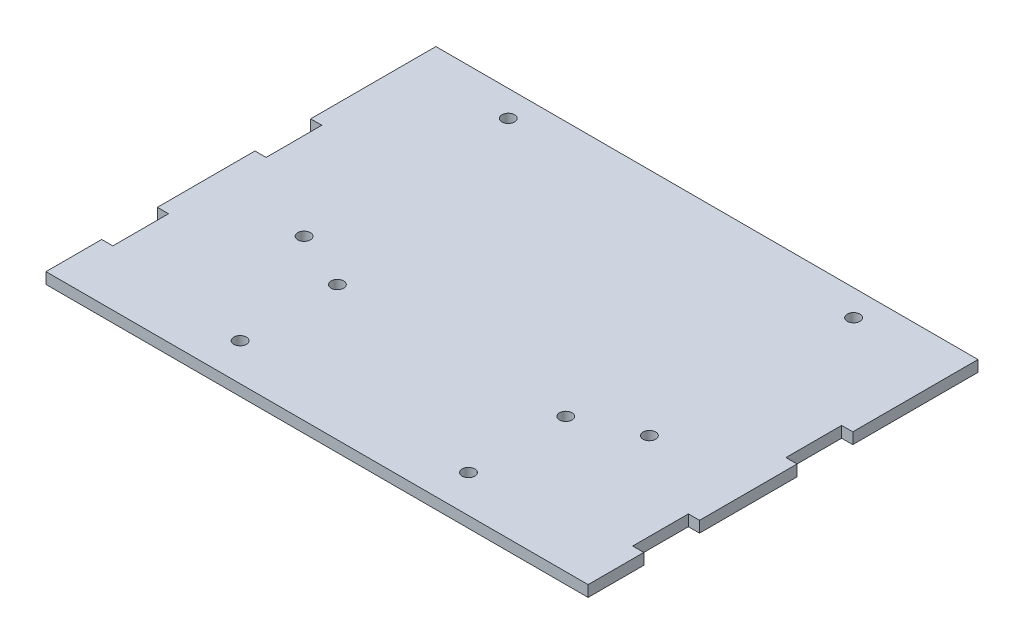
ISO-10303-21;
HEADER;
FILE_DESCRIPTION(('STEP AP214'),'2;1');
FILE_NAME('part.step','',(''),(''),'','','');
FILE_SCHEMA(('AUTOMOTIVE_DESIGN { 1 0 10303 214 1 1 1 1 }'));
ENDSEC;
DATA;
#1=APPLICATION_CONTEXT('core data for automotive mechanical design processes');
#2=APPLICATION_PROTOCOL_DEFINITION('international standard','automotive_design',2000,#1);
#3=PRODUCT_CONTEXT('',#1,'mechanical');
#4=PRODUCT('Part','Part','',(#3));
#5=PRODUCT_RELATED_PRODUCT_CATEGORY('part','',(#4));
#6=PRODUCT_DEFINITION_FORMATION('','',#4);
#7=PRODUCT_DEFINITION_CONTEXT('part definition',#1,'design');
#8=PRODUCT_DEFINITION('design','',#6,#7);
#9=PRODUCT_DEFINITION_SHAPE('','',#8);
#10=(LENGTH_UNIT() NAMED_UNIT(*) SI_UNIT(.MILLI.,.METRE.));
#11=(NAMED_UNIT(*) PLANE_ANGLE_UNIT() SI_UNIT($,.RADIAN.));
#12=(NAMED_UNIT(*) SI_UNIT($,.STERADIAN.) SOLID_ANGLE_UNIT());
#13=UNCERTAINTY_MEASURE_WITH_UNIT(LENGTH_MEASURE(1.E-05),#10,'distance_accuracy_value','');
#14=(GEOMETRIC_REPRESENTATION_CONTEXT(3) GLOBAL_UNCERTAINTY_ASSIGNED_CONTEXT((#13)) GLOBAL_UNIT_ASSIGNED_CONTEXT((#10,
#11,#12)) REPRESENTATION_CONTEXT('',''));
#15=CARTESIAN_POINT('',(0.,0.,0.));
#16=DIRECTION('',(0.,0.,1.));
#17=DIRECTION('',(1.,0.,0.));
#18=AXIS2_PLACEMENT_3D('',#15,#16,#17);
#19=CARTESIAN_POINT('',(-73.,3.,52.5));
#20=DIRECTION('',(1.,0.,0.));
#21=DIRECTION('',(0.,0.,-1.));
#22=AXIS2_PLACEMENT_3D('',#19,#20,#21);
#23=PLANE('',#22);
#24=DIRECTION('',(0.,0.,1.));
#25=VECTOR('',#24,1.);
#26=CARTESIAN_POINT('',(-73.,0.,52.5));
#27=LINE('',#26,#25);
#28=CARTESIAN_POINT('',(-73.,0.,-3.76999999999999));
#29=VERTEX_POINT('',#28);
#30=CARTESIAN_POINT('',(-73.,0.,22.5));
#31=VERTEX_POINT('',#30);
#32=EDGE_CURVE('E442',#29,#31,#27,.T.);
#33=ORIENTED_EDGE('',*,*,#32,.T.);
#34=DIRECTION('',(0.,1.,0.));
#35=VECTOR('',#34,1.);
#36=CARTESIAN_POINT('',(-73.,0.,22.5));
#37=LINE('',#36,#35);
#38=CARTESIAN_POINT('',(-73.,3.,22.5));
#39=VERTEX_POINT('',#38);
#40=EDGE_CURVE('E307',#31,#39,#37,.T.);
#41=ORIENTED_EDGE('',*,*,#40,.T.);
#42=DIRECTION('',(0.,0.,1.));
#43=VECTOR('',#42,1.);
#44=CARTESIAN_POINT('',(-73.,3.,52.5));
#45=LINE('',#44,#43);
#46=CARTESIAN_POINT('',(-73.,3.,-3.76999999999999));
#47=VERTEX_POINT('',#46);
#48=EDGE_CURVE('E216',#47,#39,#45,.T.);
#49=ORIENTED_EDGE('',*,*,#48,.F.);
#50=DIRECTION('',(0.,1.,0.));
#51=VECTOR('',#50,1.);
#52=CARTESIAN_POINT('',(-73.,0.,-3.76999999999999));
#53=LINE('',#52,#51);
#54=EDGE_CURVE('E450',#29,#47,#53,.T.);
#55=ORIENTED_EDGE('',*,*,#54,.F.);
#56=EDGE_LOOP('',(#33,#41,#49,#55));
#57=FACE_BOUND('',#56,.T.);
#58=ADVANCED_FACE('F45',(#57),#23,.F.);
#59=CARTESIAN_POINT('',(-73.,0.,-52.5));
#60=VERTEX_POINT('',#59);
#61=CARTESIAN_POINT('',(-73.,0.,-18.77));
#62=VERTEX_POINT('',#61);
#63=EDGE_CURVE('E204',#60,#62,#27,.T.);
#64=ORIENTED_EDGE('',*,*,#63,.T.);
#65=DIRECTION('',(0.,1.,0.));
#66=VECTOR('',#65,1.);
#67=CARTESIAN_POINT('',(-73.,0.,-18.77));
#68=LINE('',#67,#66);
#69=CARTESIAN_POINT('',(-73.,3.,-18.77));
#70=VERTEX_POINT('',#69);
#71=EDGE_CURVE('E186',#62,#70,#68,.T.);
#72=ORIENTED_EDGE('',*,*,#71,.T.);
#73=CARTESIAN_POINT('',(-73.,3.,-52.5));
#74=VERTEX_POINT('',#73);
#75=EDGE_CURVE('E202',#74,#70,#45,.T.);
#76=ORIENTED_EDGE('',*,*,#75,.F.);
#77=DIRECTION('',(0.,-1.,0.));
#78=VECTOR('',#77,1.);
#79=CARTESIAN_POINT('',(-73.,3.,-52.5));
#80=LINE('',#79,#78);
#81=EDGE_CURVE('E243',#74,#60,#80,.T.);
#82=ORIENTED_EDGE('',*,*,#81,.T.);
#83=EDGE_LOOP('',(#64,#72,#76,#82));
#84=FACE_BOUND('',#83,.T.);
#85=ADVANCED_FACE('F200',(#84),#23,.F.);
#86=CARTESIAN_POINT('',(73.,3.,52.5));
#87=DIRECTION('',(-1.,0.,0.));
#88=DIRECTION('',(0.,0.,1.));
#89=AXIS2_PLACEMENT_3D('',#86,#87,#88);
#90=PLANE('',#89);
#91=DIRECTION('',(0.,0.,-1.));
#92=VECTOR('',#91,1.);
#93=CARTESIAN_POINT('',(73.,0.,52.5));
#94=LINE('',#93,#92);
#95=CARTESIAN_POINT('',(73.,0.,22.5));
#96=VERTEX_POINT('',#95);
#97=CARTESIAN_POINT('',(73.,0.,-3.76999999999999));
#98=VERTEX_POINT('',#97);
#99=EDGE_CURVE('E238',#96,#98,#94,.T.);
#100=ORIENTED_EDGE('',*,*,#99,.T.);
#101=DIRECTION('',(0.,1.,0.));
#102=VECTOR('',#101,1.);
#103=CARTESIAN_POINT('',(73.,0.,-3.76999999999999));
#104=LINE('',#103,#102);
#105=CARTESIAN_POINT('',(73.,3.,-3.76999999999999));
#106=VERTEX_POINT('',#105);
#107=EDGE_CURVE('E480',#98,#106,#104,.T.);
#108=ORIENTED_EDGE('',*,*,#107,.T.);
#109=DIRECTION('',(0.,0.,-1.));
#110=VECTOR('',#109,1.);
#111=CARTESIAN_POINT('',(73.,3.,52.5));
#112=LINE('',#111,#110);
#113=CARTESIAN_POINT('',(73.,3.,22.5));
#114=VERTEX_POINT('',#113);
#115=EDGE_CURVE('E425',#114,#106,#112,.T.);
#116=ORIENTED_EDGE('',*,*,#115,.F.);
#117=DIRECTION('',(0.,1.,0.));
#118=VECTOR('',#117,1.);
#119=CARTESIAN_POINT('',(73.,0.,22.5));
#120=LINE('',#119,#118);
#121=EDGE_CURVE('E272',#96,#114,#120,.T.);
#122=ORIENTED_EDGE('',*,*,#121,.F.);
#123=EDGE_LOOP('',(#100,#108,#116,#122));
#124=FACE_BOUND('',#123,.T.);
#125=ADVANCED_FACE('F410',(#124),#90,.F.);
#126=CARTESIAN_POINT('',(73.,0.,52.5));
#127=VERTEX_POINT('',#126);
#128=CARTESIAN_POINT('',(73.,0.,37.5));
#129=VERTEX_POINT('',#128);
#130=EDGE_CURVE('E231',#127,#129,#94,.T.);
#131=ORIENTED_EDGE('',*,*,#130,.T.);
#132=DIRECTION('',(0.,1.,0.));
#133=VECTOR('',#132,1.);
#134=CARTESIAN_POINT('',(73.,0.,37.5));
#135=LINE('',#134,#133);
#136=CARTESIAN_POINT('',(73.,3.,37.5));
#137=VERTEX_POINT('',#136);
#138=EDGE_CURVE('E509',#129,#137,#135,.T.);
#139=ORIENTED_EDGE('',*,*,#138,.T.);
#140=CARTESIAN_POINT('',(73.,3.,52.5));
#141=VERTEX_POINT('',#140);
#142=EDGE_CURVE('E257',#141,#137,#112,.T.);
#143=ORIENTED_EDGE('',*,*,#142,.F.);
#144=DIRECTION('',(0.,-1.,0.));
#145=VECTOR('',#144,1.);
#146=CARTESIAN_POINT('',(73.,3.,52.5));
#147=LINE('',#146,#145);
#148=EDGE_CURVE('E54',#141,#127,#147,.T.);
#149=ORIENTED_EDGE('',*,*,#148,.T.);
#150=EDGE_LOOP('',(#131,#139,#143,#149));
#151=FACE_BOUND('',#150,.T.);
#152=ADVANCED_FACE('F254',(#151),#90,.F.);
#153=CARTESIAN_POINT('',(-73.,3.,37.5));
#154=VERTEX_POINT('',#153);
#155=CARTESIAN_POINT('',(-73.,3.,52.5));
#156=VERTEX_POINT('',#155);
#157=EDGE_CURVE('E218',#154,#156,#45,.T.);
#158=ORIENTED_EDGE('',*,*,#157,.F.);
#159=DIRECTION('',(0.,1.,0.));
#160=VECTOR('',#159,1.);
#161=CARTESIAN_POINT('',(-73.,0.,37.5));
#162=LINE('',#161,#160);
#163=CARTESIAN_POINT('',(-73.,0.,37.5));
#164=VERTEX_POINT('',#163);
#165=EDGE_CURVE('E297',#164,#154,#162,.T.);
#166=ORIENTED_EDGE('',*,*,#165,.F.);
#167=CARTESIAN_POINT('',(-73.,0.,52.5));
#168=VERTEX_POINT('',#167);
#169=EDGE_CURVE('E382',#164,#168,#27,.T.);
#170=ORIENTED_EDGE('',*,*,#169,.T.);
#171=DIRECTION('',(0.,-1.,0.));
#172=VECTOR('',#171,1.);
#173=CARTESIAN_POINT('',(-73.,3.,52.5));
#174=LINE('',#173,#172);
#175=EDGE_CURVE('E11',#156,#168,#174,.T.);
#176=ORIENTED_EDGE('',*,*,#175,.F.);
#177=EDGE_LOOP('',(#158,#166,#170,#176));
#178=FACE_BOUND('',#177,.T.);
#179=ADVANCED_FACE('F47',(#178),#23,.F.);
#180=CARTESIAN_POINT('',(73.,3.,52.5));
#181=DIRECTION('',(0.,0.,-1.));
#182=DIRECTION('',(-1.,0.,0.));
#183=AXIS2_PLACEMENT_3D('',#180,#181,#182);
#184=PLANE('',#183);
#185=DIRECTION('',(1.,0.,0.));
#186=VECTOR('',#185,1.);
#187=CARTESIAN_POINT('',(73.,0.,52.5));
#188=LINE('',#187,#186);
#189=EDGE_CURVE('E264',#168,#127,#188,.T.);
#190=ORIENTED_EDGE('',*,*,#189,.T.);
#191=ORIENTED_EDGE('',*,*,#148,.F.);
#192=DIRECTION('',(1.,0.,0.));
#193=VECTOR('',#192,1.);
#194=CARTESIAN_POINT('',(73.,3.,52.5));
#195=LINE('',#194,#193);
#196=EDGE_CURVE('E215',#156,#141,#195,.T.);
#197=ORIENTED_EDGE('',*,*,#196,.F.);
#198=ORIENTED_EDGE('',*,*,#175,.T.);
#199=EDGE_LOOP('',(#190,#191,#197,#198));
#200=FACE_BOUND('',#199,.T.);
#201=ADVANCED_FACE('F413',(#200),#184,.F.);
#202=CARTESIAN_POINT('',(73.,3.,-18.77));
#203=VERTEX_POINT('',#202);
#204=CARTESIAN_POINT('',(73.,3.,-52.5));
#205=VERTEX_POINT('',#204);
#206=EDGE_CURVE('E221',#203,#205,#112,.T.);
#207=ORIENTED_EDGE('',*,*,#206,.F.);
#208=DIRECTION('',(0.,1.,0.));
#209=VECTOR('',#208,1.);
#210=CARTESIAN_POINT('',(73.,0.,-18.77));
#211=LINE('',#210,#209);
#212=CARTESIAN_POINT('',(73.,0.,-18.77));
#213=VERTEX_POINT('',#212);
#214=EDGE_CURVE('E470',#213,#203,#211,.T.);
#215=ORIENTED_EDGE('',*,*,#214,.F.);
#216=CARTESIAN_POINT('',(73.,0.,-52.5));
#217=VERTEX_POINT('',#216);
#218=EDGE_CURVE('E240',#213,#217,#94,.T.);
#219=ORIENTED_EDGE('',*,*,#218,.T.);
#220=DIRECTION('',(0.,-1.,0.));
#221=VECTOR('',#220,1.);
#222=CARTESIAN_POINT('',(73.,3.,-52.5));
#223=LINE('',#222,#221);
#224=EDGE_CURVE('E246',#205,#217,#223,.T.);
#225=ORIENTED_EDGE('',*,*,#224,.F.);
#226=EDGE_LOOP('',(#207,#215,#219,#225));
#227=FACE_BOUND('',#226,.T.);
#228=ADVANCED_FACE('F400',(#227),#90,.F.);
#229=CARTESIAN_POINT('',(73.,3.,-52.5));
#230=DIRECTION('',(0.,0.,1.));
#231=DIRECTION('',(1.,0.,0.));
#232=AXIS2_PLACEMENT_3D('',#229,#230,#231);
#233=PLANE('',#232);
#234=DIRECTION('',(-1.,0.,0.));
#235=VECTOR('',#234,1.);
#236=CARTESIAN_POINT('',(73.,0.,-52.5));
#237=LINE('',#236,#235);
#238=EDGE_CURVE('E226',#217,#60,#237,.T.);
#239=ORIENTED_EDGE('',*,*,#238,.T.);
#240=ORIENTED_EDGE('',*,*,#81,.F.);
#241=DIRECTION('',(-1.,0.,0.));
#242=VECTOR('',#241,1.);
#243=CARTESIAN_POINT('',(73.,3.,-52.5));
#244=LINE('',#243,#242);
#245=EDGE_CURVE('E212',#205,#74,#244,.T.);
#246=ORIENTED_EDGE('',*,*,#245,.F.);
#247=ORIENTED_EDGE('',*,*,#224,.T.);
#248=EDGE_LOOP('',(#239,#240,#246,#247));
#249=FACE_BOUND('',#248,.T.);
#250=ADVANCED_FACE('F390',(#249),#233,.F.);
#251=CARTESIAN_POINT('',(0.,3.,0.));
#252=DIRECTION('',(0.,1.,0.));
#253=DIRECTION('',(0.,0.,1.));
#254=AXIS2_PLACEMENT_3D('',#251,#252,#253);
#255=PLANE('',#254);
#256=CARTESIAN_POINT('',(30.75,3.,42.478395091037));
#257=DIRECTION('',(0.,1.,0.));
#258=DIRECTION('',(0.,0.,1.));
#259=AXIS2_PLACEMENT_3D('',#256,#257,#258);
#260=CIRCLE('',#259,1.7);
#261=CARTESIAN_POINT('',(30.75,3.,44.178395091037));
#262=VERTEX_POINT('',#261);
#263=EDGE_CURVE('E331',#262,#262,#260,.T.);
#264=ORIENTED_EDGE('',*,*,#263,.F.);
#265=EDGE_LOOP('',(#264));
#266=FACE_BOUND('',#265,.T.);
#267=CARTESIAN_POINT('',(-30.75,3.,16.278395091037));
#268=DIRECTION('',(0.,1.,0.));
#269=DIRECTION('',(0.,0.,1.));
#270=AXIS2_PLACEMENT_3D('',#267,#268,#269);
#271=CIRCLE('',#270,1.7);
#272=CARTESIAN_POINT('',(-30.75,3.,17.978395091037));
#273=VERTEX_POINT('',#272);
#274=EDGE_CURVE('E340',#273,#273,#271,.T.);
#275=ORIENTED_EDGE('',*,*,#274,.F.);
#276=EDGE_LOOP('',(#275));
#277=FACE_BOUND('',#276,.T.);
#278=CARTESIAN_POINT('',(-30.75,3.,42.478395091037));
#279=DIRECTION('',(0.,1.,0.));
#280=DIRECTION('',(0.,0.,1.));
#281=AXIS2_PLACEMENT_3D('',#278,#279,#280);
#282=CIRCLE('',#281,1.7);
#283=CARTESIAN_POINT('',(-30.75,3.,44.178395091037));
#284=VERTEX_POINT('',#283);
#285=EDGE_CURVE('E287',#284,#284,#282,.T.);
#286=ORIENTED_EDGE('',*,*,#285,.F.);
#287=EDGE_LOOP('',(#286));
#288=FACE_BOUND('',#287,.T.);
#289=DIRECTION('',(-1.,0.,0.));
#290=VECTOR('',#289,1.);
#291=CARTESIAN_POINT('',(-70.,3.,22.5));
#292=LINE('',#291,#290);
#293=CARTESIAN_POINT('',(-70.,3.,22.5));
#294=VERTEX_POINT('',#293);
#295=EDGE_CURVE('E312',#294,#39,#292,.T.);
#296=ORIENTED_EDGE('',*,*,#295,.F.);
#297=DIRECTION('',(0.,0.,-1.));
#298=VECTOR('',#297,1.);
#299=CARTESIAN_POINT('',(-70.,3.,37.5));
#300=LINE('',#299,#298);
#301=CARTESIAN_POINT('',(-70.,3.,37.5));
#302=VERTEX_POINT('',#301);
#303=EDGE_CURVE('E315',#302,#294,#300,.T.);
#304=ORIENTED_EDGE('',*,*,#303,.F.);
#305=DIRECTION('',(1.,0.,0.));
#306=VECTOR('',#305,1.);
#307=CARTESIAN_POINT('',(-73.,3.,37.5));
#308=LINE('',#307,#306);
#309=EDGE_CURVE('E296',#154,#302,#308,.T.);
#310=ORIENTED_EDGE('',*,*,#309,.F.);
#311=ORIENTED_EDGE('',*,*,#157,.T.);
#312=ORIENTED_EDGE('',*,*,#196,.T.);
#313=ORIENTED_EDGE('',*,*,#142,.T.);
#314=DIRECTION('',(1.,0.,0.));
#315=VECTOR('',#314,1.);
#316=CARTESIAN_POINT('',(70.,3.,37.5));
#317=LINE('',#316,#315);
#318=CARTESIAN_POINT('',(70.,3.,37.5));
#319=VERTEX_POINT('',#318);
#320=EDGE_CURVE('E286',#319,#137,#317,.T.);
#321=ORIENTED_EDGE('',*,*,#320,.F.);
#322=DIRECTION('',(0.,0.,1.));
#323=VECTOR('',#322,1.);
#324=CARTESIAN_POINT('',(70.,3.,22.5));
#325=LINE('',#324,#323);
#326=CARTESIAN_POINT('',(70.,3.,22.5));
#327=VERTEX_POINT('',#326);
#328=EDGE_CURVE('E513',#327,#319,#325,.T.);
#329=ORIENTED_EDGE('',*,*,#328,.F.);
#330=DIRECTION('',(-1.,0.,0.));
#331=VECTOR('',#330,1.);
#332=CARTESIAN_POINT('',(73.,3.,22.5));
#333=LINE('',#332,#331);
#334=EDGE_CURVE('E281',#114,#327,#333,.T.);
#335=ORIENTED_EDGE('',*,*,#334,.F.);
#336=ORIENTED_EDGE('',*,*,#115,.T.);
#337=DIRECTION('',(1.,0.,0.));
#338=VECTOR('',#337,1.);
#339=CARTESIAN_POINT('',(70.,3.,-3.76999999999999));
#340=LINE('',#339,#338);
#341=CARTESIAN_POINT('',(70.,3.,-3.76999999999999));
#342=VERTEX_POINT('',#341);
#343=EDGE_CURVE('E484',#342,#106,#340,.T.);
#344=ORIENTED_EDGE('',*,*,#343,.F.);
#345=DIRECTION('',(0.,0.,1.));
#346=VECTOR('',#345,1.);
#347=CARTESIAN_POINT('',(70.,3.,-18.77));
#348=LINE('',#347,#346);
#349=CARTESIAN_POINT('',(70.,3.,-18.77));
#350=VERTEX_POINT('',#349);
#351=EDGE_CURVE('E487',#350,#342,#348,.T.);
#352=ORIENTED_EDGE('',*,*,#351,.F.);
#353=DIRECTION('',(-1.,0.,0.));
#354=VECTOR('',#353,1.);
#355=CARTESIAN_POINT('',(73.,3.,-18.77));
#356=LINE('',#355,#354);
#357=EDGE_CURVE('E206',#203,#350,#356,.T.);
#358=ORIENTED_EDGE('',*,*,#357,.F.);
#359=ORIENTED_EDGE('',*,*,#206,.T.);
#360=ORIENTED_EDGE('',*,*,#245,.T.);
#361=ORIENTED_EDGE('',*,*,#75,.T.);
#362=DIRECTION('',(-1.,0.,0.));
#363=VECTOR('',#362,1.);
#364=CARTESIAN_POINT('',(-70.,3.,-18.77));
#365=LINE('',#364,#363);
#366=CARTESIAN_POINT('',(-70.,3.,-18.77));
#367=VERTEX_POINT('',#366);
#368=EDGE_CURVE('E182',#367,#70,#365,.T.);
#369=ORIENTED_EDGE('',*,*,#368,.F.);
#370=DIRECTION('',(0.,0.,-1.));
#371=VECTOR('',#370,1.);
#372=CARTESIAN_POINT('',(-70.,3.,-3.76999999999999));
#373=LINE('',#372,#371);
#374=CARTESIAN_POINT('',(-70.,3.,-3.76999999999999));
#375=VERTEX_POINT('',#374);
#376=EDGE_CURVE('E194',#375,#367,#373,.T.);
#377=ORIENTED_EDGE('',*,*,#376,.F.);
#378=DIRECTION('',(1.,0.,0.));
#379=VECTOR('',#378,1.);
#380=CARTESIAN_POINT('',(-73.,3.,-3.76999999999999));
#381=LINE('',#380,#379);
#382=EDGE_CURVE('E311',#47,#375,#381,.T.);
#383=ORIENTED_EDGE('',*,*,#382,.F.);
#384=ORIENTED_EDGE('',*,*,#48,.T.);
#385=EDGE_LOOP('',(#296,#304,#310,#311,#312,#313,#321,#329,#335,#336,#344,#352,#358,#359,#360,
#361,#369,#377,#383,#384));
#386=FACE_BOUND('',#385,.T.);
#387=CARTESIAN_POINT('',(30.75,3.,16.278395091037));
#388=DIRECTION('',(0.,1.,0.));
#389=DIRECTION('',(0.,0.,1.));
#390=AXIS2_PLACEMENT_3D('',#387,#388,#389);
#391=CIRCLE('',#390,1.7);
#392=CARTESIAN_POINT('',(30.75,3.,17.978395091037));
#393=VERTEX_POINT('',#392);
#394=EDGE_CURVE('E372',#393,#393,#391,.T.);
#395=ORIENTED_EDGE('',*,*,#394,.F.);
#396=EDGE_LOOP('',(#395));
#397=FACE_BOUND('',#396,.T.);
#398=CARTESIAN_POINT('',(-46.5,3.,9.5));
#399=DIRECTION('',(0.,1.,0.));
#400=DIRECTION('',(0.,0.,1.));
#401=AXIS2_PLACEMENT_3D('',#398,#399,#400);
#402=CIRCLE('',#401,1.7);
#403=CARTESIAN_POINT('',(-46.5,3.,11.2));
#404=VERTEX_POINT('',#403);
#405=EDGE_CURVE('E364',#404,#404,#402,.T.);
#406=ORIENTED_EDGE('',*,*,#405,.F.);
#407=EDGE_LOOP('',(#406));
#408=FACE_BOUND('',#407,.T.);
#409=CARTESIAN_POINT('',(46.5,3.,9.5));
#410=DIRECTION('',(0.,1.,0.));
#411=DIRECTION('',(0.,0.,1.));
#412=AXIS2_PLACEMENT_3D('',#409,#410,#411);
#413=CIRCLE('',#412,1.7);
#414=CARTESIAN_POINT('',(46.5,3.,11.2));
#415=VERTEX_POINT('',#414);
#416=EDGE_CURVE('E356',#415,#415,#413,.T.);
#417=ORIENTED_EDGE('',*,*,#416,.F.);
#418=EDGE_LOOP('',(#417));
#419=FACE_BOUND('',#418,.T.);
#420=CARTESIAN_POINT('',(46.5,3.,-45.5));
#421=DIRECTION('',(0.,1.,0.));
#422=DIRECTION('',(0.,0.,1.));
#423=AXIS2_PLACEMENT_3D('',#420,#421,#422);
#424=CIRCLE('',#423,1.7);
#425=CARTESIAN_POINT('',(46.5,3.,-43.8));
#426=VERTEX_POINT('',#425);
#427=EDGE_CURVE('E347',#426,#426,#424,.T.);
#428=ORIENTED_EDGE('',*,*,#427,.F.);
#429=EDGE_LOOP('',(#428));
#430=FACE_BOUND('',#429,.T.);
#431=CARTESIAN_POINT('',(-46.5,3.,-45.5));
#432=DIRECTION('',(0.,1.,0.));
#433=DIRECTION('',(0.,0.,1.));
#434=AXIS2_PLACEMENT_3D('',#431,#432,#433);
#435=CIRCLE('',#434,1.7);
#436=CARTESIAN_POINT('',(-46.5,3.,-43.8));
#437=VERTEX_POINT('',#436);
#438=EDGE_CURVE('E351',#437,#437,#435,.T.);
#439=ORIENTED_EDGE('',*,*,#438,.F.);
#440=EDGE_LOOP('',(#439));
#441=FACE_BOUND('',#440,.T.);
#442=ADVANCED_FACE('F209',(#266,#277,#288,#386,#397,#408,#419,#430,#441),#255,.T.);
#443=CARTESIAN_POINT('',(0.,0.,0.));
#444=DIRECTION('',(0.,1.,0.));
#445=DIRECTION('',(0.,0.,1.));
#446=AXIS2_PLACEMENT_3D('',#443,#444,#445);
#447=PLANE('',#446);
#448=CARTESIAN_POINT('',(30.75,0.,42.478395091037));
#449=DIRECTION('',(0.,1.,0.));
#450=DIRECTION('',(0.,0.,1.));
#451=AXIS2_PLACEMENT_3D('',#448,#449,#450);
#452=CIRCLE('',#451,1.7);
#453=CARTESIAN_POINT('',(30.75,0.,44.178395091037));
#454=VERTEX_POINT('',#453);
#455=EDGE_CURVE('E336',#454,#454,#452,.T.);
#456=ORIENTED_EDGE('',*,*,#455,.T.);
#457=EDGE_LOOP('',(#456));
#458=FACE_BOUND('',#457,.T.);
#459=CARTESIAN_POINT('',(-30.75,0.,16.278395091037));
#460=DIRECTION('',(0.,1.,0.));
#461=DIRECTION('',(0.,0.,1.));
#462=AXIS2_PLACEMENT_3D('',#459,#460,#461);
#463=CIRCLE('',#462,1.7);
#464=CARTESIAN_POINT('',(-30.75,0.,17.978395091037));
#465=VERTEX_POINT('',#464);
#466=EDGE_CURVE('E291',#465,#465,#463,.T.);
#467=ORIENTED_EDGE('',*,*,#466,.T.);
#468=EDGE_LOOP('',(#467));
#469=FACE_BOUND('',#468,.T.);
#470=CARTESIAN_POINT('',(-30.75,0.,42.478395091037));
#471=DIRECTION('',(0.,1.,0.));
#472=DIRECTION('',(0.,0.,1.));
#473=AXIS2_PLACEMENT_3D('',#470,#471,#472);
#474=CIRCLE('',#473,1.7);
#475=CARTESIAN_POINT('',(-30.75,0.,44.178395091037));
#476=VERTEX_POINT('',#475);
#477=EDGE_CURVE('E292',#476,#476,#474,.T.);
#478=ORIENTED_EDGE('',*,*,#477,.T.);
#479=EDGE_LOOP('',(#478));
#480=FACE_BOUND('',#479,.T.);
#481=CARTESIAN_POINT('',(30.75,0.,16.278395091037));
#482=DIRECTION('',(0.,1.,0.));
#483=DIRECTION('',(0.,0.,1.));
#484=AXIS2_PLACEMENT_3D('',#481,#482,#483);
#485=CIRCLE('',#484,1.7);
#486=CARTESIAN_POINT('',(30.75,0.,17.978395091037));
#487=VERTEX_POINT('',#486);
#488=EDGE_CURVE('E335',#487,#487,#485,.T.);
#489=ORIENTED_EDGE('',*,*,#488,.T.);
#490=EDGE_LOOP('',(#489));
#491=FACE_BOUND('',#490,.T.);
#492=CARTESIAN_POINT('',(-46.5,0.,9.5));
#493=DIRECTION('',(0.,1.,0.));
#494=DIRECTION('',(0.,0.,1.));
#495=AXIS2_PLACEMENT_3D('',#492,#493,#494);
#496=CIRCLE('',#495,1.7);
#497=CARTESIAN_POINT('',(-46.5,0.,11.2));
#498=VERTEX_POINT('',#497);
#499=EDGE_CURVE('E368',#498,#498,#496,.T.);
#500=ORIENTED_EDGE('',*,*,#499,.T.);
#501=EDGE_LOOP('',(#500));
#502=FACE_BOUND('',#501,.T.);
#503=CARTESIAN_POINT('',(46.5,0.,9.5));
#504=DIRECTION('',(0.,1.,0.));
#505=DIRECTION('',(0.,0.,1.));
#506=AXIS2_PLACEMENT_3D('',#503,#504,#505);
#507=CIRCLE('',#506,1.7);
#508=CARTESIAN_POINT('',(46.5,0.,11.2));
#509=VERTEX_POINT('',#508);
#510=EDGE_CURVE('E360',#509,#509,#507,.T.);
#511=ORIENTED_EDGE('',*,*,#510,.T.);
#512=EDGE_LOOP('',(#511));
#513=FACE_BOUND('',#512,.T.);
#514=CARTESIAN_POINT('',(46.5,0.,-45.5));
#515=DIRECTION('',(0.,1.,0.));
#516=DIRECTION('',(0.,0.,1.));
#517=AXIS2_PLACEMENT_3D('',#514,#515,#516);
#518=CIRCLE('',#517,1.7);
#519=CARTESIAN_POINT('',(46.5,0.,-43.8));
#520=VERTEX_POINT('',#519);
#521=EDGE_CURVE('E352',#520,#520,#518,.T.);
#522=ORIENTED_EDGE('',*,*,#521,.T.);
#523=EDGE_LOOP('',(#522));
#524=FACE_BOUND('',#523,.T.);
#525=CARTESIAN_POINT('',(-46.5,0.,-45.5));
#526=DIRECTION('',(0.,1.,0.));
#527=DIRECTION('',(0.,0.,1.));
#528=AXIS2_PLACEMENT_3D('',#525,#526,#527);
#529=CIRCLE('',#528,1.7);
#530=CARTESIAN_POINT('',(-46.5,0.,-43.8));
#531=VERTEX_POINT('',#530);
#532=EDGE_CURVE('E379',#531,#531,#529,.T.);
#533=ORIENTED_EDGE('',*,*,#532,.T.);
#534=EDGE_LOOP('',(#533));
#535=FACE_BOUND('',#534,.T.);
#536=DIRECTION('',(0.,0.,-1.));
#537=VECTOR('',#536,1.);
#538=CARTESIAN_POINT('',(-70.,0.,37.5));
#539=LINE('',#538,#537);
#540=CARTESIAN_POINT('',(-70.,0.,37.5));
#541=VERTEX_POINT('',#540);
#542=CARTESIAN_POINT('',(-70.,0.,22.5));
#543=VERTEX_POINT('',#542);
#544=EDGE_CURVE('E61',#541,#543,#539,.T.);
#545=ORIENTED_EDGE('',*,*,#544,.T.);
#546=DIRECTION('',(-1.,0.,0.));
#547=VECTOR('',#546,1.);
#548=CARTESIAN_POINT('',(-70.,0.,22.5));
#549=LINE('',#548,#547);
#550=EDGE_CURVE('E300',#543,#31,#549,.T.);
#551=ORIENTED_EDGE('',*,*,#550,.T.);
#552=ORIENTED_EDGE('',*,*,#32,.F.);
#553=DIRECTION('',(1.,0.,0.));
#554=VECTOR('',#553,1.);
#555=CARTESIAN_POINT('',(-73.,0.,-3.76999999999999));
#556=LINE('',#555,#554);
#557=CARTESIAN_POINT('',(-70.,0.,-3.76999999999999));
#558=VERTEX_POINT('',#557);
#559=EDGE_CURVE('E195',#29,#558,#556,.T.);
#560=ORIENTED_EDGE('',*,*,#559,.T.);
#561=DIRECTION('',(0.,0.,-1.));
#562=VECTOR('',#561,1.);
#563=CARTESIAN_POINT('',(-70.,0.,-3.76999999999999));
#564=LINE('',#563,#562);
#565=CARTESIAN_POINT('',(-70.,0.,-18.77));
#566=VERTEX_POINT('',#565);
#567=EDGE_CURVE('E69',#558,#566,#564,.T.);
#568=ORIENTED_EDGE('',*,*,#567,.T.);
#569=DIRECTION('',(-1.,0.,0.));
#570=VECTOR('',#569,1.);
#571=CARTESIAN_POINT('',(-70.,0.,-18.77));
#572=LINE('',#571,#570);
#573=EDGE_CURVE('E440',#566,#62,#572,.T.);
#574=ORIENTED_EDGE('',*,*,#573,.T.);
#575=ORIENTED_EDGE('',*,*,#63,.F.);
#576=ORIENTED_EDGE('',*,*,#238,.F.);
#577=ORIENTED_EDGE('',*,*,#218,.F.);
#578=DIRECTION('',(-1.,0.,0.));
#579=VECTOR('',#578,1.);
#580=CARTESIAN_POINT('',(73.,0.,-18.77));
#581=LINE('',#580,#579);
#582=CARTESIAN_POINT('',(70.,0.,-18.77));
#583=VERTEX_POINT('',#582);
#584=EDGE_CURVE('E488',#213,#583,#581,.T.);
#585=ORIENTED_EDGE('',*,*,#584,.T.);
#586=DIRECTION('',(0.,0.,1.));
#587=VECTOR('',#586,1.);
#588=CARTESIAN_POINT('',(70.,0.,-18.77));
#589=LINE('',#588,#587);
#590=CARTESIAN_POINT('',(70.,0.,-3.76999999999999));
#591=VERTEX_POINT('',#590);
#592=EDGE_CURVE('E497',#583,#591,#589,.T.);
#593=ORIENTED_EDGE('',*,*,#592,.T.);
#594=DIRECTION('',(1.,0.,0.));
#595=VECTOR('',#594,1.);
#596=CARTESIAN_POINT('',(70.,0.,-3.76999999999999));
#597=LINE('',#596,#595);
#598=EDGE_CURVE('E473',#591,#98,#597,.T.);
#599=ORIENTED_EDGE('',*,*,#598,.T.);
#600=ORIENTED_EDGE('',*,*,#99,.F.);
#601=DIRECTION('',(-1.,0.,0.));
#602=VECTOR('',#601,1.);
#603=CARTESIAN_POINT('',(73.,0.,22.5));
#604=LINE('',#603,#602);
#605=CARTESIAN_POINT('',(70.,0.,22.5));
#606=VERTEX_POINT('',#605);
#607=EDGE_CURVE('E276',#96,#606,#604,.T.);
#608=ORIENTED_EDGE('',*,*,#607,.T.);
#609=DIRECTION('',(0.,0.,1.));
#610=VECTOR('',#609,1.);
#611=CARTESIAN_POINT('',(70.,0.,22.5));
#612=LINE('',#611,#610);
#613=CARTESIAN_POINT('',(70.,0.,37.5));
#614=VERTEX_POINT('',#613);
#615=EDGE_CURVE('E269',#606,#614,#612,.T.);
#616=ORIENTED_EDGE('',*,*,#615,.T.);
#617=DIRECTION('',(1.,0.,0.));
#618=VECTOR('',#617,1.);
#619=CARTESIAN_POINT('',(70.,0.,37.5));
#620=LINE('',#619,#618);
#621=EDGE_CURVE('E267',#614,#129,#620,.T.);
#622=ORIENTED_EDGE('',*,*,#621,.T.);
#623=ORIENTED_EDGE('',*,*,#130,.F.);
#624=ORIENTED_EDGE('',*,*,#189,.F.);
#625=ORIENTED_EDGE('',*,*,#169,.F.);
#626=DIRECTION('',(1.,0.,0.));
#627=VECTOR('',#626,1.);
#628=CARTESIAN_POINT('',(-73.,0.,37.5));
#629=LINE('',#628,#627);
#630=EDGE_CURVE('E316',#164,#541,#629,.T.);
#631=ORIENTED_EDGE('',*,*,#630,.T.);
#632=EDGE_LOOP('',(#545,#551,#552,#560,#568,#574,#575,#576,#577,#585,#593,#599,#600,#608,#616,
#622,#623,#624,#625,#631));
#633=FACE_BOUND('',#632,.T.);
#634=ADVANCED_FACE('F262',(#458,#469,#480,#491,#502,#513,#524,#535,#633),#447,.F.);
#635=CARTESIAN_POINT('',(-46.5,0.,-45.5));
#636=DIRECTION('',(0.,1.,0.));
#637=DIRECTION('',(0.,0.,1.));
#638=AXIS2_PLACEMENT_3D('',#635,#636,#637);
#639=CYLINDRICAL_SURFACE('',#638,1.7);
#640=ORIENTED_EDGE('',*,*,#532,.F.);
#641=EDGE_LOOP('',(#640));
#642=FACE_BOUND('',#641,.T.);
#643=ORIENTED_EDGE('',*,*,#438,.T.);
#644=EDGE_LOOP('',(#643));
#645=FACE_BOUND('',#644,.T.);
#646=ADVANCED_FACE('F387',(#642,#645),#639,.F.);
#647=CARTESIAN_POINT('',(70.,0.,37.5));
#648=DIRECTION('',(0.,0.,1.));
#649=DIRECTION('',(1.,0.,0.));
#650=AXIS2_PLACEMENT_3D('',#647,#648,#649);
#651=PLANE('',#650);
#652=ORIENTED_EDGE('',*,*,#320,.T.);
#653=ORIENTED_EDGE('',*,*,#138,.F.);
#654=ORIENTED_EDGE('',*,*,#621,.F.);
#655=DIRECTION('',(0.,1.,0.));
#656=VECTOR('',#655,1.);
#657=CARTESIAN_POINT('',(70.,0.,37.5));
#658=LINE('',#657,#656);
#659=EDGE_CURVE('E506',#614,#319,#658,.T.);
#660=ORIENTED_EDGE('',*,*,#659,.T.);
#661=EDGE_LOOP('',(#652,#653,#654,#660));
#662=FACE_BOUND('',#661,.T.);
#663=ADVANCED_FACE('F557',(#662),#651,.F.);
#664=CARTESIAN_POINT('',(70.,0.,22.5));
#665=DIRECTION('',(-1.,0.,0.));
#666=DIRECTION('',(0.,0.,1.));
#667=AXIS2_PLACEMENT_3D('',#664,#665,#666);
#668=PLANE('',#667);
#669=ORIENTED_EDGE('',*,*,#328,.T.);
#670=ORIENTED_EDGE('',*,*,#659,.F.);
#671=ORIENTED_EDGE('',*,*,#615,.F.);
#672=DIRECTION('',(0.,1.,0.));
#673=VECTOR('',#672,1.);
#674=CARTESIAN_POINT('',(70.,0.,22.5));
#675=LINE('',#674,#673);
#676=EDGE_CURVE('E278',#606,#327,#675,.T.);
#677=ORIENTED_EDGE('',*,*,#676,.T.);
#678=EDGE_LOOP('',(#669,#670,#671,#677));
#679=FACE_BOUND('',#678,.T.);
#680=ADVANCED_FACE('F554',(#679),#668,.F.);
#681=CARTESIAN_POINT('',(73.,0.,22.5));
#682=DIRECTION('',(0.,0.,-1.));
#683=DIRECTION('',(-1.,0.,0.));
#684=AXIS2_PLACEMENT_3D('',#681,#682,#683);
#685=PLANE('',#684);
#686=ORIENTED_EDGE('',*,*,#334,.T.);
#687=ORIENTED_EDGE('',*,*,#676,.F.);
#688=ORIENTED_EDGE('',*,*,#607,.F.);
#689=ORIENTED_EDGE('',*,*,#121,.T.);
#690=EDGE_LOOP('',(#686,#687,#688,#689));
#691=FACE_BOUND('',#690,.T.);
#692=ADVANCED_FACE('F522',(#691),#685,.F.);
#693=CARTESIAN_POINT('',(70.,0.,-3.76999999999999));
#694=DIRECTION('',(0.,0.,1.));
#695=DIRECTION('',(1.,0.,0.));
#696=AXIS2_PLACEMENT_3D('',#693,#694,#695);
#697=PLANE('',#696);
#698=ORIENTED_EDGE('',*,*,#343,.T.);
#699=ORIENTED_EDGE('',*,*,#107,.F.);
#700=ORIENTED_EDGE('',*,*,#598,.F.);
#701=DIRECTION('',(0.,1.,0.));
#702=VECTOR('',#701,1.);
#703=CARTESIAN_POINT('',(70.,0.,-3.76999999999999));
#704=LINE('',#703,#702);
#705=EDGE_CURVE('E477',#591,#342,#704,.T.);
#706=ORIENTED_EDGE('',*,*,#705,.T.);
#707=EDGE_LOOP('',(#698,#699,#700,#706));
#708=FACE_BOUND('',#707,.T.);
#709=ADVANCED_FACE('F531',(#708),#697,.F.);
#710=CARTESIAN_POINT('',(70.,0.,-18.77));
#711=DIRECTION('',(-1.,0.,0.));
#712=DIRECTION('',(0.,0.,1.));
#713=AXIS2_PLACEMENT_3D('',#710,#711,#712);
#714=PLANE('',#713);
#715=ORIENTED_EDGE('',*,*,#351,.T.);
#716=ORIENTED_EDGE('',*,*,#705,.F.);
#717=ORIENTED_EDGE('',*,*,#592,.F.);
#718=DIRECTION('',(0.,1.,0.));
#719=VECTOR('',#718,1.);
#720=CARTESIAN_POINT('',(70.,0.,-18.77));
#721=LINE('',#720,#719);
#722=EDGE_CURVE('E474',#583,#350,#721,.T.);
#723=ORIENTED_EDGE('',*,*,#722,.T.);
#724=EDGE_LOOP('',(#715,#716,#717,#723));
#725=FACE_BOUND('',#724,.T.);
#726=ADVANCED_FACE('F534',(#725),#714,.F.);
#727=CARTESIAN_POINT('',(73.,0.,-18.77));
#728=DIRECTION('',(0.,0.,-1.));
#729=DIRECTION('',(-1.,0.,0.));
#730=AXIS2_PLACEMENT_3D('',#727,#728,#729);
#731=PLANE('',#730);
#732=ORIENTED_EDGE('',*,*,#357,.T.);
#733=ORIENTED_EDGE('',*,*,#722,.F.);
#734=ORIENTED_EDGE('',*,*,#584,.F.);
#735=ORIENTED_EDGE('',*,*,#214,.T.);
#736=EDGE_LOOP('',(#732,#733,#734,#735));
#737=FACE_BOUND('',#736,.T.);
#738=ADVANCED_FACE('F536',(#737),#731,.F.);
#739=CARTESIAN_POINT('',(-70.,0.,-18.77));
#740=DIRECTION('',(0.,0.,-1.));
#741=DIRECTION('',(-1.,0.,0.));
#742=AXIS2_PLACEMENT_3D('',#739,#740,#741);
#743=PLANE('',#742);
#744=ORIENTED_EDGE('',*,*,#368,.T.);
#745=ORIENTED_EDGE('',*,*,#71,.F.);
#746=ORIENTED_EDGE('',*,*,#573,.F.);
#747=DIRECTION('',(0.,1.,0.));
#748=VECTOR('',#747,1.);
#749=CARTESIAN_POINT('',(-70.,0.,-18.77));
#750=LINE('',#749,#748);
#751=EDGE_CURVE('E188',#566,#367,#750,.T.);
#752=ORIENTED_EDGE('',*,*,#751,.T.);
#753=EDGE_LOOP('',(#744,#745,#746,#752));
#754=FACE_BOUND('',#753,.T.);
#755=ADVANCED_FACE('F184',(#754),#743,.F.);
#756=CARTESIAN_POINT('',(-70.,0.,-3.76999999999999));
#757=DIRECTION('',(1.,0.,0.));
#758=DIRECTION('',(0.,0.,-1.));
#759=AXIS2_PLACEMENT_3D('',#756,#757,#758);
#760=PLANE('',#759);
#761=ORIENTED_EDGE('',*,*,#376,.T.);
#762=ORIENTED_EDGE('',*,*,#751,.F.);
#763=ORIENTED_EDGE('',*,*,#567,.F.);
#764=DIRECTION('',(0.,1.,0.));
#765=VECTOR('',#764,1.);
#766=CARTESIAN_POINT('',(-70.,0.,-3.76999999999999));
#767=LINE('',#766,#765);
#768=EDGE_CURVE('E720',#558,#375,#767,.T.);
#769=ORIENTED_EDGE('',*,*,#768,.T.);
#770=EDGE_LOOP('',(#761,#762,#763,#769));
#771=FACE_BOUND('',#770,.T.);
#772=ADVANCED_FACE('F545',(#771),#760,.F.);
#773=CARTESIAN_POINT('',(-73.,0.,-3.76999999999999));
#774=DIRECTION('',(0.,0.,1.));
#775=DIRECTION('',(1.,0.,0.));
#776=AXIS2_PLACEMENT_3D('',#773,#774,#775);
#777=PLANE('',#776);
#778=ORIENTED_EDGE('',*,*,#382,.T.);
#779=ORIENTED_EDGE('',*,*,#768,.F.);
#780=ORIENTED_EDGE('',*,*,#559,.F.);
#781=ORIENTED_EDGE('',*,*,#54,.T.);
#782=EDGE_LOOP('',(#778,#779,#780,#781));
#783=FACE_BOUND('',#782,.T.);
#784=ADVANCED_FACE('F586',(#783),#777,.F.);
#785=CARTESIAN_POINT('',(46.5,0.,-45.5));
#786=DIRECTION('',(0.,1.,0.));
#787=DIRECTION('',(0.,0.,1.));
#788=AXIS2_PLACEMENT_3D('',#785,#786,#787);
#789=CYLINDRICAL_SURFACE('',#788,1.7);
#790=ORIENTED_EDGE('',*,*,#521,.F.);
#791=EDGE_LOOP('',(#790));
#792=FACE_BOUND('',#791,.T.);
#793=ORIENTED_EDGE('',*,*,#427,.T.);
#794=EDGE_LOOP('',(#793));
#795=FACE_BOUND('',#794,.T.);
#796=ADVANCED_FACE('F582',(#792,#795),#789,.F.);
#797=CARTESIAN_POINT('',(46.5,0.,9.5));
#798=DIRECTION('',(0.,1.,0.));
#799=DIRECTION('',(0.,0.,1.));
#800=AXIS2_PLACEMENT_3D('',#797,#798,#799);
#801=CYLINDRICAL_SURFACE('',#800,1.7);
#802=ORIENTED_EDGE('',*,*,#510,.F.);
#803=EDGE_LOOP('',(#802));
#804=FACE_BOUND('',#803,.T.);
#805=ORIENTED_EDGE('',*,*,#416,.T.);
#806=EDGE_LOOP('',(#805));
#807=FACE_BOUND('',#806,.T.);
#808=ADVANCED_FACE('F585',(#804,#807),#801,.F.);
#809=CARTESIAN_POINT('',(-46.5,0.,9.5));
#810=DIRECTION('',(0.,1.,0.));
#811=DIRECTION('',(0.,0.,1.));
#812=AXIS2_PLACEMENT_3D('',#809,#810,#811);
#813=CYLINDRICAL_SURFACE('',#812,1.7);
#814=ORIENTED_EDGE('',*,*,#499,.F.);
#815=EDGE_LOOP('',(#814));
#816=FACE_BOUND('',#815,.T.);
#817=ORIENTED_EDGE('',*,*,#405,.T.);
#818=EDGE_LOOP('',(#817));
#819=FACE_BOUND('',#818,.T.);
#820=ADVANCED_FACE('F590',(#816,#819),#813,.F.);
#821=CARTESIAN_POINT('',(30.75,0.,16.278395091037));
#822=DIRECTION('',(0.,1.,0.));
#823=DIRECTION('',(0.,0.,1.));
#824=AXIS2_PLACEMENT_3D('',#821,#822,#823);
#825=CYLINDRICAL_SURFACE('',#824,1.7);
#826=ORIENTED_EDGE('',*,*,#488,.F.);
#827=EDGE_LOOP('',(#826));
#828=FACE_BOUND('',#827,.T.);
#829=ORIENTED_EDGE('',*,*,#394,.T.);
#830=EDGE_LOOP('',(#829));
#831=FACE_BOUND('',#830,.T.);
#832=ADVANCED_FACE('F574',(#828,#831),#825,.F.);
#833=CARTESIAN_POINT('',(-70.,0.,22.5));
#834=DIRECTION('',(0.,0.,-1.));
#835=DIRECTION('',(-1.,0.,0.));
#836=AXIS2_PLACEMENT_3D('',#833,#834,#835);
#837=PLANE('',#836);
#838=ORIENTED_EDGE('',*,*,#295,.T.);
#839=ORIENTED_EDGE('',*,*,#40,.F.);
#840=ORIENTED_EDGE('',*,*,#550,.F.);
#841=DIRECTION('',(0.,1.,0.));
#842=VECTOR('',#841,1.);
#843=CARTESIAN_POINT('',(-70.,0.,22.5));
#844=LINE('',#843,#842);
#845=EDGE_CURVE('E304',#543,#294,#844,.T.);
#846=ORIENTED_EDGE('',*,*,#845,.T.);
#847=EDGE_LOOP('',(#838,#839,#840,#846));
#848=FACE_BOUND('',#847,.T.);
#849=ADVANCED_FACE('F454',(#848),#837,.F.);
#850=CARTESIAN_POINT('',(-70.,0.,37.5));
#851=DIRECTION('',(1.,0.,0.));
#852=DIRECTION('',(0.,0.,-1.));
#853=AXIS2_PLACEMENT_3D('',#850,#851,#852);
#854=PLANE('',#853);
#855=ORIENTED_EDGE('',*,*,#303,.T.);
#856=ORIENTED_EDGE('',*,*,#845,.F.);
#857=ORIENTED_EDGE('',*,*,#544,.F.);
#858=DIRECTION('',(0.,1.,0.));
#859=VECTOR('',#858,1.);
#860=CARTESIAN_POINT('',(-70.,0.,37.5));
#861=LINE('',#860,#859);
#862=EDGE_CURVE('E301',#541,#302,#861,.T.);
#863=ORIENTED_EDGE('',*,*,#862,.T.);
#864=EDGE_LOOP('',(#855,#856,#857,#863));
#865=FACE_BOUND('',#864,.T.);
#866=ADVANCED_FACE('F568',(#865),#854,.F.);
#867=CARTESIAN_POINT('',(-73.,0.,37.5));
#868=DIRECTION('',(0.,0.,1.));
#869=DIRECTION('',(1.,0.,0.));
#870=AXIS2_PLACEMENT_3D('',#867,#868,#869);
#871=PLANE('',#870);
#872=ORIENTED_EDGE('',*,*,#309,.T.);
#873=ORIENTED_EDGE('',*,*,#862,.F.);
#874=ORIENTED_EDGE('',*,*,#630,.F.);
#875=ORIENTED_EDGE('',*,*,#165,.T.);
#876=EDGE_LOOP('',(#872,#873,#874,#875));
#877=FACE_BOUND('',#876,.T.);
#878=ADVANCED_FACE('F564',(#877),#871,.F.);
#879=CARTESIAN_POINT('',(-30.75,0.,42.478395091037));
#880=DIRECTION('',(0.,1.,0.));
#881=DIRECTION('',(0.,0.,1.));
#882=AXIS2_PLACEMENT_3D('',#879,#880,#881);
#883=CYLINDRICAL_SURFACE('',#882,1.7);
#884=ORIENTED_EDGE('',*,*,#477,.F.);
#885=EDGE_LOOP('',(#884));
#886=FACE_BOUND('',#885,.T.);
#887=ORIENTED_EDGE('',*,*,#285,.T.);
#888=EDGE_LOOP('',(#887));
#889=FACE_BOUND('',#888,.T.);
#890=ADVANCED_FACE('F560',(#886,#889),#883,.F.);
#891=CARTESIAN_POINT('',(-30.75,0.,16.278395091037));
#892=DIRECTION('',(0.,1.,0.));
#893=DIRECTION('',(0.,0.,1.));
#894=AXIS2_PLACEMENT_3D('',#891,#892,#893);
#895=CYLINDRICAL_SURFACE('',#894,1.7);
#896=ORIENTED_EDGE('',*,*,#466,.F.);
#897=EDGE_LOOP('',(#896));
#898=FACE_BOUND('',#897,.T.);
#899=ORIENTED_EDGE('',*,*,#274,.T.);
#900=EDGE_LOOP('',(#899));
#901=FACE_BOUND('',#900,.T.);
#902=ADVANCED_FACE('F563',(#898,#901),#895,.F.);
#903=CARTESIAN_POINT('',(30.75,0.,42.478395091037));
#904=DIRECTION('',(0.,1.,0.));
#905=DIRECTION('',(0.,0.,1.));
#906=AXIS2_PLACEMENT_3D('',#903,#904,#905);
#907=CYLINDRICAL_SURFACE('',#906,1.7);
#908=ORIENTED_EDGE('',*,*,#455,.F.);
#909=EDGE_LOOP('',(#908));
#910=FACE_BOUND('',#909,.T.);
#911=ORIENTED_EDGE('',*,*,#263,.T.);
#912=EDGE_LOOP('',(#911));
#913=FACE_BOUND('',#912,.T.);
#914=ADVANCED_FACE('F575',(#910,#913),#907,.F.);
#915=CLOSED_SHELL('',(#58,#85,#125,#152,#179,#201,#228,#250,#442,#634,#646,#663,#680,#692,#709,
#726,#738,#755,#772,#784,#796,#808,#820,#832,#849,#866,#878,#890,#902,#914));
#916=MANIFOLD_SOLID_BREP('B2',#915);
#917=ADVANCED_BREP_SHAPE_REPRESENTATION('',(#18,#916),#14);
#918=SHAPE_DEFINITION_REPRESENTATION(#9,#917);
ENDSEC;
END-ISO-10303-21;
